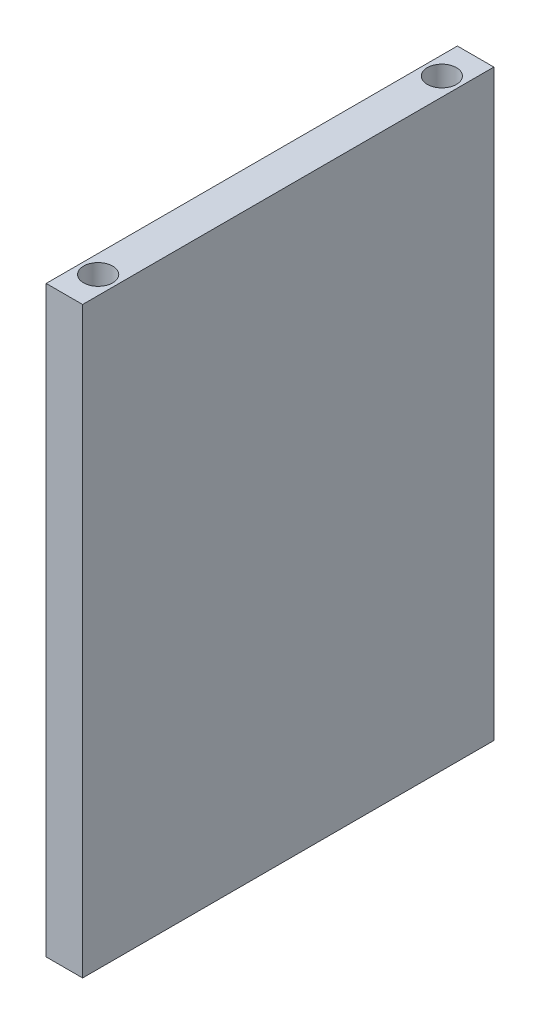
ISO-10303-21;
HEADER;
FILE_DESCRIPTION(('STEP AP214'),'2;1');
FILE_NAME('part.step','',(''),(''),'','','');
FILE_SCHEMA(('AUTOMOTIVE_DESIGN { 1 0 10303 214 1 1 1 1 }'));
ENDSEC;
DATA;
#1=APPLICATION_CONTEXT('core data for automotive mechanical design processes');
#2=APPLICATION_PROTOCOL_DEFINITION('international standard','automotive_design',2000,#1);
#3=PRODUCT_CONTEXT('',#1,'mechanical');
#4=PRODUCT('Part','Part','',(#3));
#5=PRODUCT_RELATED_PRODUCT_CATEGORY('part','',(#4));
#6=PRODUCT_DEFINITION_FORMATION('','',#4);
#7=PRODUCT_DEFINITION_CONTEXT('part definition',#1,'design');
#8=PRODUCT_DEFINITION('design','',#6,#7);
#9=PRODUCT_DEFINITION_SHAPE('','',#8);
#10=(LENGTH_UNIT() NAMED_UNIT(*) SI_UNIT(.MILLI.,.METRE.));
#11=(NAMED_UNIT(*) PLANE_ANGLE_UNIT() SI_UNIT($,.RADIAN.));
#12=(NAMED_UNIT(*) SI_UNIT($,.STERADIAN.) SOLID_ANGLE_UNIT());
#13=UNCERTAINTY_MEASURE_WITH_UNIT(LENGTH_MEASURE(1.E-05),#10,'distance_accuracy_value','');
#14=(GEOMETRIC_REPRESENTATION_CONTEXT(3) GLOBAL_UNCERTAINTY_ASSIGNED_CONTEXT((#13)) GLOBAL_UNIT_ASSIGNED_CONTEXT((#10,
#11,#12)) REPRESENTATION_CONTEXT('',''));
#15=CARTESIAN_POINT('',(0.,0.,0.));
#16=DIRECTION('',(0.,0.,1.));
#17=DIRECTION('',(1.,0.,0.));
#18=AXIS2_PLACEMENT_3D('',#15,#16,#17);
#19=CARTESIAN_POINT('',(5.,0.,0.));
#20=DIRECTION('',(0.,0.,-1.));
#21=DIRECTION('',(-1.,0.,0.));
#22=AXIS2_PLACEMENT_3D('',#19,#20,#21);
#23=PLANE('',#22);
#24=DIRECTION('',(0.,-1.,0.));
#25=VECTOR('',#24,1.);
#26=CARTESIAN_POINT('',(0.,0.,0.));
#27=LINE('',#26,#25);
#28=CARTESIAN_POINT('',(0.,80.,0.));
#29=VERTEX_POINT('',#28);
#30=CARTESIAN_POINT('',(0.,0.,0.));
#31=VERTEX_POINT('',#30);
#32=EDGE_CURVE('E96',#29,#31,#27,.T.);
#33=ORIENTED_EDGE('',*,*,#32,.T.);
#34=DIRECTION('',(-1.,0.,0.));
#35=VECTOR('',#34,1.);
#36=CARTESIAN_POINT('',(5.,0.,0.));
#37=LINE('',#36,#35);
#38=CARTESIAN_POINT('',(5.,0.,0.));
#39=VERTEX_POINT('',#38);
#40=EDGE_CURVE('E11',#39,#31,#37,.T.);
#41=ORIENTED_EDGE('',*,*,#40,.F.);
#42=DIRECTION('',(0.,-1.,0.));
#43=VECTOR('',#42,1.);
#44=CARTESIAN_POINT('',(5.,0.,0.));
#45=LINE('',#44,#43);
#46=CARTESIAN_POINT('',(5.,80.,0.));
#47=VERTEX_POINT('',#46);
#48=EDGE_CURVE('E84',#47,#39,#45,.T.);
#49=ORIENTED_EDGE('',*,*,#48,.F.);
#50=DIRECTION('',(-1.,0.,0.));
#51=VECTOR('',#50,1.);
#52=CARTESIAN_POINT('',(5.,80.,0.));
#53=LINE('',#52,#51);
#54=EDGE_CURVE('E92',#47,#29,#53,.T.);
#55=ORIENTED_EDGE('',*,*,#54,.T.);
#56=EDGE_LOOP('',(#33,#41,#49,#55));
#57=FACE_BOUND('',#56,.T.);
#58=ADVANCED_FACE('F33',(#57),#23,.F.);
#59=CARTESIAN_POINT('',(5.,0.,0.));
#60=DIRECTION('',(0.,1.,0.));
#61=DIRECTION('',(0.,0.,1.));
#62=AXIS2_PLACEMENT_3D('',#59,#60,#61);
#63=PLANE('',#62);
#64=CARTESIAN_POINT('',(2.49999999999999,0.,-51.77));
#65=DIRECTION('',(0.,1.,0.));
#66=DIRECTION('',(0.,0.,1.));
#67=AXIS2_PLACEMENT_3D('',#64,#65,#66);
#68=CIRCLE('',#67,1.99999999999998);
#69=CARTESIAN_POINT('',(2.49999999999999,0.,-49.77));
#70=VERTEX_POINT('',#69);
#71=EDGE_CURVE('E115',#70,#70,#68,.T.);
#72=ORIENTED_EDGE('',*,*,#71,.T.);
#73=EDGE_LOOP('',(#72));
#74=FACE_BOUND('',#73,.T.);
#75=CARTESIAN_POINT('',(2.49999999999999,0.,-4.63));
#76=DIRECTION('',(0.,1.,0.));
#77=DIRECTION('',(0.,0.,1.));
#78=AXIS2_PLACEMENT_3D('',#75,#76,#77);
#79=CIRCLE('',#78,1.99999999999998);
#80=CARTESIAN_POINT('',(2.49999999999999,0.,-2.63000000000002));
#81=VERTEX_POINT('',#80);
#82=EDGE_CURVE('E99',#81,#81,#79,.T.);
#83=ORIENTED_EDGE('',*,*,#82,.T.);
#84=EDGE_LOOP('',(#83));
#85=FACE_BOUND('',#84,.T.);
#86=DIRECTION('',(0.,0.,-1.));
#87=VECTOR('',#86,1.);
#88=CARTESIAN_POINT('',(0.,0.,0.));
#89=LINE('',#88,#87);
#90=CARTESIAN_POINT('',(0.,0.,-56.4));
#91=VERTEX_POINT('',#90);
#92=EDGE_CURVE('E88',#31,#91,#89,.T.);
#93=ORIENTED_EDGE('',*,*,#92,.T.);
#94=DIRECTION('',(-1.,0.,0.));
#95=VECTOR('',#94,1.);
#96=CARTESIAN_POINT('',(5.,0.,-56.4));
#97=LINE('',#96,#95);
#98=CARTESIAN_POINT('',(5.,0.,-56.4));
#99=VERTEX_POINT('',#98);
#100=EDGE_CURVE('E41',#99,#91,#97,.T.);
#101=ORIENTED_EDGE('',*,*,#100,.F.);
#102=DIRECTION('',(0.,0.,-1.));
#103=VECTOR('',#102,1.);
#104=CARTESIAN_POINT('',(5.,0.,0.));
#105=LINE('',#104,#103);
#106=EDGE_CURVE('E79',#39,#99,#105,.T.);
#107=ORIENTED_EDGE('',*,*,#106,.F.);
#108=ORIENTED_EDGE('',*,*,#40,.T.);
#109=EDGE_LOOP('',(#93,#101,#107,#108));
#110=FACE_BOUND('',#109,.T.);
#111=ADVANCED_FACE('F87',(#74,#85,#110),#63,.F.);
#112=CARTESIAN_POINT('',(5.,0.,-56.4));
#113=DIRECTION('',(0.,0.,1.));
#114=DIRECTION('',(1.,0.,0.));
#115=AXIS2_PLACEMENT_3D('',#112,#113,#114);
#116=PLANE('',#115);
#117=DIRECTION('',(0.,1.,0.));
#118=VECTOR('',#117,1.);
#119=CARTESIAN_POINT('',(0.,0.,-56.4));
#120=LINE('',#119,#118);
#121=CARTESIAN_POINT('',(0.,80.,-56.4));
#122=VERTEX_POINT('',#121);
#123=EDGE_CURVE('E66',#91,#122,#120,.T.);
#124=ORIENTED_EDGE('',*,*,#123,.T.);
#125=DIRECTION('',(-1.,0.,0.));
#126=VECTOR('',#125,1.);
#127=CARTESIAN_POINT('',(5.,80.,-56.4));
#128=LINE('',#127,#126);
#129=CARTESIAN_POINT('',(5.,80.,-56.4));
#130=VERTEX_POINT('',#129);
#131=EDGE_CURVE('E89',#130,#122,#128,.T.);
#132=ORIENTED_EDGE('',*,*,#131,.F.);
#133=DIRECTION('',(0.,1.,0.));
#134=VECTOR('',#133,1.);
#135=CARTESIAN_POINT('',(5.,0.,-56.4));
#136=LINE('',#135,#134);
#137=EDGE_CURVE('E82',#99,#130,#136,.T.);
#138=ORIENTED_EDGE('',*,*,#137,.F.);
#139=ORIENTED_EDGE('',*,*,#100,.T.);
#140=EDGE_LOOP('',(#124,#132,#138,#139));
#141=FACE_BOUND('',#140,.T.);
#142=ADVANCED_FACE('F90',(#141),#116,.F.);
#143=CARTESIAN_POINT('',(5.,80.,0.));
#144=DIRECTION('',(0.,-1.,0.));
#145=DIRECTION('',(0.,0.,-1.));
#146=AXIS2_PLACEMENT_3D('',#143,#144,#145);
#147=PLANE('',#146);
#148=CARTESIAN_POINT('',(2.49999999999999,80.,-51.77));
#149=DIRECTION('',(0.,1.,0.));
#150=DIRECTION('',(0.,0.,1.));
#151=AXIS2_PLACEMENT_3D('',#148,#149,#150);
#152=CIRCLE('',#151,2.);
#153=CARTESIAN_POINT('',(2.49999999999999,80.,-49.77));
#154=VERTEX_POINT('',#153);
#155=EDGE_CURVE('E118',#154,#154,#152,.T.);
#156=ORIENTED_EDGE('',*,*,#155,.F.);
#157=EDGE_LOOP('',(#156));
#158=FACE_BOUND('',#157,.T.);
#159=CARTESIAN_POINT('',(2.49999999999999,80.,-4.63));
#160=DIRECTION('',(0.,1.,0.));
#161=DIRECTION('',(0.,0.,1.));
#162=AXIS2_PLACEMENT_3D('',#159,#160,#161);
#163=CIRCLE('',#162,2.);
#164=CARTESIAN_POINT('',(2.49999999999999,80.,-2.63000000000001));
#165=VERTEX_POINT('',#164);
#166=EDGE_CURVE('E112',#165,#165,#163,.T.);
#167=ORIENTED_EDGE('',*,*,#166,.F.);
#168=EDGE_LOOP('',(#167));
#169=FACE_BOUND('',#168,.T.);
#170=DIRECTION('',(0.,0.,1.));
#171=VECTOR('',#170,1.);
#172=CARTESIAN_POINT('',(0.,80.,0.));
#173=LINE('',#172,#171);
#174=EDGE_CURVE('E72',#122,#29,#173,.T.);
#175=ORIENTED_EDGE('',*,*,#174,.T.);
#176=ORIENTED_EDGE('',*,*,#54,.F.);
#177=DIRECTION('',(0.,0.,1.));
#178=VECTOR('',#177,1.);
#179=CARTESIAN_POINT('',(5.,80.,0.));
#180=LINE('',#179,#178);
#181=EDGE_CURVE('E49',#130,#47,#180,.T.);
#182=ORIENTED_EDGE('',*,*,#181,.F.);
#183=ORIENTED_EDGE('',*,*,#131,.T.);
#184=EDGE_LOOP('',(#175,#176,#182,#183));
#185=FACE_BOUND('',#184,.T.);
#186=ADVANCED_FACE('F104',(#158,#169,#185),#147,.F.);
#187=CARTESIAN_POINT('',(5.,0.,0.));
#188=DIRECTION('',(-1.,0.,0.));
#189=DIRECTION('',(0.,0.,1.));
#190=AXIS2_PLACEMENT_3D('',#187,#188,#189);
#191=PLANE('',#190);
#192=ORIENTED_EDGE('',*,*,#48,.T.);
#193=ORIENTED_EDGE('',*,*,#106,.T.);
#194=ORIENTED_EDGE('',*,*,#137,.T.);
#195=ORIENTED_EDGE('',*,*,#181,.T.);
#196=EDGE_LOOP('',(#192,#193,#194,#195));
#197=FACE_BOUND('',#196,.T.);
#198=ADVANCED_FACE('F80',(#197),#191,.F.);
#199=CARTESIAN_POINT('',(0.,0.,0.));
#200=DIRECTION('',(-1.,0.,0.));
#201=DIRECTION('',(0.,0.,1.));
#202=AXIS2_PLACEMENT_3D('',#199,#200,#201);
#203=PLANE('',#202);
#204=ORIENTED_EDGE('',*,*,#32,.F.);
#205=ORIENTED_EDGE('',*,*,#174,.F.);
#206=ORIENTED_EDGE('',*,*,#123,.F.);
#207=ORIENTED_EDGE('',*,*,#92,.F.);
#208=EDGE_LOOP('',(#204,#205,#206,#207));
#209=FACE_BOUND('',#208,.T.);
#210=ADVANCED_FACE('F107',(#209),#203,.T.);
#211=CARTESIAN_POINT('',(2.49999999999999,80.,-4.63));
#212=DIRECTION('',(0.,1.,0.));
#213=DIRECTION('',(0.,0.,1.));
#214=AXIS2_PLACEMENT_3D('',#211,#212,#213);
#215=CYLINDRICAL_SURFACE('',#214,1.99999999999999);
#216=ORIENTED_EDGE('',*,*,#82,.F.);
#217=EDGE_LOOP('',(#216));
#218=FACE_BOUND('',#217,.T.);
#219=ORIENTED_EDGE('',*,*,#166,.T.);
#220=EDGE_LOOP('',(#219));
#221=FACE_BOUND('',#220,.T.);
#222=ADVANCED_FACE('F129',(#218,#221),#215,.F.);
#223=CARTESIAN_POINT('',(2.49999999999999,80.,-51.77));
#224=DIRECTION('',(0.,1.,0.));
#225=DIRECTION('',(0.,0.,1.));
#226=AXIS2_PLACEMENT_3D('',#223,#224,#225);
#227=CYLINDRICAL_SURFACE('',#226,1.99999999999999);
#228=ORIENTED_EDGE('',*,*,#71,.F.);
#229=EDGE_LOOP('',(#228));
#230=FACE_BOUND('',#229,.T.);
#231=ORIENTED_EDGE('',*,*,#155,.T.);
#232=EDGE_LOOP('',(#231));
#233=FACE_BOUND('',#232,.T.);
#234=ADVANCED_FACE('F122',(#230,#233),#227,.F.);
#235=CLOSED_SHELL('',(#58,#111,#142,#186,#198,#210,#222,#234));
#236=MANIFOLD_SOLID_BREP('B2',#235);
#237=ADVANCED_BREP_SHAPE_REPRESENTATION('',(#18,#236),#14);
#238=SHAPE_DEFINITION_REPRESENTATION(#9,#237);
ENDSEC;
END-ISO-10303-21;
